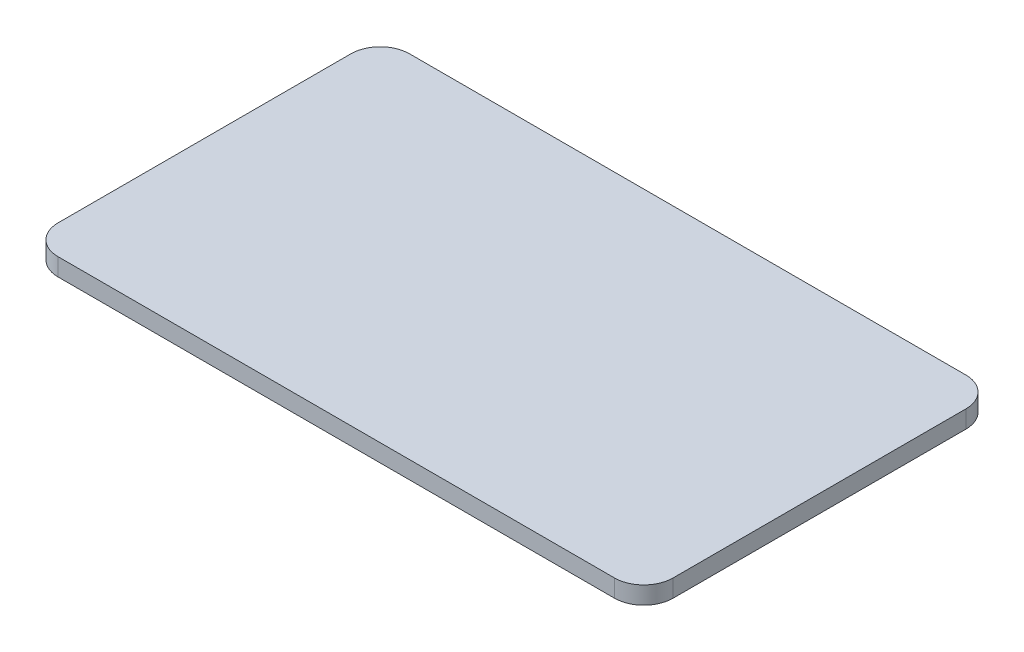
ISO-10303-21;
HEADER;
FILE_DESCRIPTION(('STEP AP214'),'2;1');
FILE_NAME('part.step','',(''),(''),'','','');
FILE_SCHEMA(('AUTOMOTIVE_DESIGN { 1 0 10303 214 1 1 1 1 }'));
ENDSEC;
DATA;
#1=APPLICATION_CONTEXT('core data for automotive mechanical design processes');
#2=APPLICATION_PROTOCOL_DEFINITION('international standard','automotive_design',2000,#1);
#3=PRODUCT_CONTEXT('',#1,'mechanical');
#4=PRODUCT('Part','Part','',(#3));
#5=PRODUCT_RELATED_PRODUCT_CATEGORY('part','',(#4));
#6=PRODUCT_DEFINITION_FORMATION('','',#4);
#7=PRODUCT_DEFINITION_CONTEXT('part definition',#1,'design');
#8=PRODUCT_DEFINITION('design','',#6,#7);
#9=PRODUCT_DEFINITION_SHAPE('','',#8);
#10=(LENGTH_UNIT() NAMED_UNIT(*) SI_UNIT(.MILLI.,.METRE.));
#11=(NAMED_UNIT(*) PLANE_ANGLE_UNIT() SI_UNIT($,.RADIAN.));
#12=(NAMED_UNIT(*) SI_UNIT($,.STERADIAN.) SOLID_ANGLE_UNIT());
#13=UNCERTAINTY_MEASURE_WITH_UNIT(LENGTH_MEASURE(1.E-05),#10,'distance_accuracy_value','');
#14=(GEOMETRIC_REPRESENTATION_CONTEXT(3) GLOBAL_UNCERTAINTY_ASSIGNED_CONTEXT((#13)) GLOBAL_UNIT_ASSIGNED_CONTEXT((#10,
#11,#12)) REPRESENTATION_CONTEXT('',''));
#15=CARTESIAN_POINT('',(0.,0.,0.));
#16=DIRECTION('',(0.,0.,1.));
#17=DIRECTION('',(1.,0.,0.));
#18=AXIS2_PLACEMENT_3D('',#15,#16,#17);
#19=CARTESIAN_POINT('',(47.5,3.,25.));
#20=DIRECTION('',(0.,-1.,0.));
#21=DIRECTION('',(0.,0.,-1.));
#22=AXIS2_PLACEMENT_3D('',#19,#20,#21);
#23=CYLINDRICAL_SURFACE('',#22,5.);
#24=CARTESIAN_POINT('',(47.5,0.,25.));
#25=DIRECTION('',(0.,1.,0.));
#26=DIRECTION('',(0.,0.,1.));
#27=AXIS2_PLACEMENT_3D('',#24,#25,#26);
#28=CIRCLE('',#27,5.);
#29=CARTESIAN_POINT('',(47.5,0.,30.));
#30=VERTEX_POINT('',#29);
#31=CARTESIAN_POINT('',(52.5,0.,25.));
#32=VERTEX_POINT('',#31);
#33=EDGE_CURVE('E129',#30,#32,#28,.T.);
#34=ORIENTED_EDGE('',*,*,#33,.T.);
#35=DIRECTION('',(0.,-1.,0.));
#36=VECTOR('',#35,1.);
#37=CARTESIAN_POINT('',(52.5,3.,25.));
#38=LINE('',#37,#36);
#39=CARTESIAN_POINT('',(52.5,3.,25.));
#40=VERTEX_POINT('',#39);
#41=EDGE_CURVE('E11',#40,#32,#38,.T.);
#42=ORIENTED_EDGE('',*,*,#41,.F.);
#43=CARTESIAN_POINT('',(47.5,3.,25.));
#44=DIRECTION('',(0.,1.,0.));
#45=DIRECTION('',(0.,0.,1.));
#46=AXIS2_PLACEMENT_3D('',#43,#44,#45);
#47=CIRCLE('',#46,5.);
#48=CARTESIAN_POINT('',(47.5,3.,30.));
#49=VERTEX_POINT('',#48);
#50=EDGE_CURVE('E143',#49,#40,#47,.T.);
#51=ORIENTED_EDGE('',*,*,#50,.F.);
#52=DIRECTION('',(0.,-1.,0.));
#53=VECTOR('',#52,1.);
#54=CARTESIAN_POINT('',(47.5,3.,30.));
#55=LINE('',#54,#53);
#56=EDGE_CURVE('E125',#49,#30,#55,.T.);
#57=ORIENTED_EDGE('',*,*,#56,.T.);
#58=EDGE_LOOP('',(#34,#42,#51,#57));
#59=FACE_BOUND('',#58,.T.);
#60=ADVANCED_FACE('F33',(#59),#23,.T.);
#61=CARTESIAN_POINT('',(52.5,3.,25.));
#62=DIRECTION('',(-1.,0.,0.));
#63=DIRECTION('',(0.,0.,1.));
#64=AXIS2_PLACEMENT_3D('',#61,#62,#63);
#65=PLANE('',#64);
#66=DIRECTION('',(0.,0.,-1.));
#67=VECTOR('',#66,1.);
#68=CARTESIAN_POINT('',(52.5,0.,25.));
#69=LINE('',#68,#67);
#70=CARTESIAN_POINT('',(52.5,0.,-25.));
#71=VERTEX_POINT('',#70);
#72=EDGE_CURVE('E132',#32,#71,#69,.T.);
#73=ORIENTED_EDGE('',*,*,#72,.T.);
#74=DIRECTION('',(0.,-1.,0.));
#75=VECTOR('',#74,1.);
#76=CARTESIAN_POINT('',(52.5,3.,-25.));
#77=LINE('',#76,#75);
#78=CARTESIAN_POINT('',(52.5,3.,-25.));
#79=VERTEX_POINT('',#78);
#80=EDGE_CURVE('E41',#79,#71,#77,.T.);
#81=ORIENTED_EDGE('',*,*,#80,.F.);
#82=DIRECTION('',(0.,0.,-1.));
#83=VECTOR('',#82,1.);
#84=CARTESIAN_POINT('',(52.5,3.,25.));
#85=LINE('',#84,#83);
#86=EDGE_CURVE('E92',#40,#79,#85,.T.);
#87=ORIENTED_EDGE('',*,*,#86,.F.);
#88=ORIENTED_EDGE('',*,*,#41,.T.);
#89=EDGE_LOOP('',(#73,#81,#87,#88));
#90=FACE_BOUND('',#89,.T.);
#91=ADVANCED_FACE('F178',(#90),#65,.F.);
#92=CARTESIAN_POINT('',(47.5,3.,-25.));
#93=DIRECTION('',(0.,-1.,0.));
#94=DIRECTION('',(0.,0.,-1.));
#95=AXIS2_PLACEMENT_3D('',#92,#93,#94);
#96=CYLINDRICAL_SURFACE('',#95,5.);
#97=CARTESIAN_POINT('',(47.5,0.,-25.));
#98=DIRECTION('',(0.,1.,0.));
#99=DIRECTION('',(0.,0.,1.));
#100=AXIS2_PLACEMENT_3D('',#97,#98,#99);
#101=CIRCLE('',#100,5.);
#102=CARTESIAN_POINT('',(47.5,0.,-30.));
#103=VERTEX_POINT('',#102);
#104=EDGE_CURVE('E134',#71,#103,#101,.T.);
#105=ORIENTED_EDGE('',*,*,#104,.T.);
#106=DIRECTION('',(0.,-1.,0.));
#107=VECTOR('',#106,1.);
#108=CARTESIAN_POINT('',(47.5,3.,-30.));
#109=LINE('',#108,#107);
#110=CARTESIAN_POINT('',(47.5,3.,-30.));
#111=VERTEX_POINT('',#110);
#112=EDGE_CURVE('E150',#111,#103,#109,.T.);
#113=ORIENTED_EDGE('',*,*,#112,.F.);
#114=CARTESIAN_POINT('',(47.5,3.,-25.));
#115=DIRECTION('',(0.,1.,0.));
#116=DIRECTION('',(0.,0.,1.));
#117=AXIS2_PLACEMENT_3D('',#114,#115,#116);
#118=CIRCLE('',#117,5.);
#119=EDGE_CURVE('E158',#79,#111,#118,.T.);
#120=ORIENTED_EDGE('',*,*,#119,.F.);
#121=ORIENTED_EDGE('',*,*,#80,.T.);
#122=EDGE_LOOP('',(#105,#113,#120,#121));
#123=FACE_BOUND('',#122,.T.);
#124=ADVANCED_FACE('F156',(#123),#96,.T.);
#125=CARTESIAN_POINT('',(47.5,3.,-30.));
#126=DIRECTION('',(0.,0.,1.));
#127=DIRECTION('',(1.,0.,0.));
#128=AXIS2_PLACEMENT_3D('',#125,#126,#127);
#129=PLANE('',#128);
#130=DIRECTION('',(-1.,0.,0.));
#131=VECTOR('',#130,1.);
#132=CARTESIAN_POINT('',(47.5,0.,-30.));
#133=LINE('',#132,#131);
#134=CARTESIAN_POINT('',(-47.5,0.,-30.));
#135=VERTEX_POINT('',#134);
#136=EDGE_CURVE('E136',#103,#135,#133,.T.);
#137=ORIENTED_EDGE('',*,*,#136,.T.);
#138=DIRECTION('',(0.,-1.,0.));
#139=VECTOR('',#138,1.);
#140=CARTESIAN_POINT('',(-47.5,3.,-30.));
#141=LINE('',#140,#139);
#142=CARTESIAN_POINT('',(-47.5,3.,-30.));
#143=VERTEX_POINT('',#142);
#144=EDGE_CURVE('E147',#143,#135,#141,.T.);
#145=ORIENTED_EDGE('',*,*,#144,.F.);
#146=DIRECTION('',(-1.,0.,0.));
#147=VECTOR('',#146,1.);
#148=CARTESIAN_POINT('',(47.5,3.,-30.));
#149=LINE('',#148,#147);
#150=EDGE_CURVE('E170',#111,#143,#149,.T.);
#151=ORIENTED_EDGE('',*,*,#150,.F.);
#152=ORIENTED_EDGE('',*,*,#112,.T.);
#153=EDGE_LOOP('',(#137,#145,#151,#152));
#154=FACE_BOUND('',#153,.T.);
#155=ADVANCED_FACE('F166',(#154),#129,.F.);
#156=CARTESIAN_POINT('',(-47.5,3.,-25.));
#157=DIRECTION('',(0.,-1.,0.));
#158=DIRECTION('',(0.,0.,-1.));
#159=AXIS2_PLACEMENT_3D('',#156,#157,#158);
#160=CYLINDRICAL_SURFACE('',#159,5.);
#161=CARTESIAN_POINT('',(-47.5,0.,-25.));
#162=DIRECTION('',(0.,1.,0.));
#163=DIRECTION('',(0.,0.,1.));
#164=AXIS2_PLACEMENT_3D('',#161,#162,#163);
#165=CIRCLE('',#164,5.);
#166=CARTESIAN_POINT('',(-52.5,0.,-25.));
#167=VERTEX_POINT('',#166);
#168=EDGE_CURVE('E138',#135,#167,#165,.T.);
#169=ORIENTED_EDGE('',*,*,#168,.T.);
#170=DIRECTION('',(0.,-1.,0.));
#171=VECTOR('',#170,1.);
#172=CARTESIAN_POINT('',(-52.5,3.,-25.));
#173=LINE('',#172,#171);
#174=CARTESIAN_POINT('',(-52.5,3.,-25.));
#175=VERTEX_POINT('',#174);
#176=EDGE_CURVE('E120',#175,#167,#173,.T.);
#177=ORIENTED_EDGE('',*,*,#176,.F.);
#178=CARTESIAN_POINT('',(-47.5,3.,-25.));
#179=DIRECTION('',(0.,1.,0.));
#180=DIRECTION('',(0.,0.,1.));
#181=AXIS2_PLACEMENT_3D('',#178,#179,#180);
#182=CIRCLE('',#181,5.);
#183=EDGE_CURVE('E111',#143,#175,#182,.T.);
#184=ORIENTED_EDGE('',*,*,#183,.F.);
#185=ORIENTED_EDGE('',*,*,#144,.T.);
#186=EDGE_LOOP('',(#169,#177,#184,#185));
#187=FACE_BOUND('',#186,.T.);
#188=ADVANCED_FACE('F169',(#187),#160,.T.);
#189=CARTESIAN_POINT('',(-52.5,3.,25.));
#190=DIRECTION('',(1.,0.,0.));
#191=DIRECTION('',(0.,0.,-1.));
#192=AXIS2_PLACEMENT_3D('',#189,#190,#191);
#193=PLANE('',#192);
#194=DIRECTION('',(0.,0.,1.));
#195=VECTOR('',#194,1.);
#196=CARTESIAN_POINT('',(-52.5,0.,25.));
#197=LINE('',#196,#195);
#198=CARTESIAN_POINT('',(-52.5,0.,25.));
#199=VERTEX_POINT('',#198);
#200=EDGE_CURVE('E119',#167,#199,#197,.T.);
#201=ORIENTED_EDGE('',*,*,#200,.T.);
#202=DIRECTION('',(0.,-1.,0.));
#203=VECTOR('',#202,1.);
#204=CARTESIAN_POINT('',(-52.5,3.,25.));
#205=LINE('',#204,#203);
#206=CARTESIAN_POINT('',(-52.5,3.,25.));
#207=VERTEX_POINT('',#206);
#208=EDGE_CURVE('E116',#207,#199,#205,.T.);
#209=ORIENTED_EDGE('',*,*,#208,.F.);
#210=DIRECTION('',(0.,0.,1.));
#211=VECTOR('',#210,1.);
#212=CARTESIAN_POINT('',(-52.5,3.,25.));
#213=LINE('',#212,#211);
#214=EDGE_CURVE('E105',#175,#207,#213,.T.);
#215=ORIENTED_EDGE('',*,*,#214,.F.);
#216=ORIENTED_EDGE('',*,*,#176,.T.);
#217=EDGE_LOOP('',(#201,#209,#215,#216));
#218=FACE_BOUND('',#217,.T.);
#219=ADVANCED_FACE('F117',(#218),#193,.F.);
#220=CARTESIAN_POINT('',(-47.5,3.,25.));
#221=DIRECTION('',(0.,-1.,0.));
#222=DIRECTION('',(0.,0.,-1.));
#223=AXIS2_PLACEMENT_3D('',#220,#221,#222);
#224=CYLINDRICAL_SURFACE('',#223,5.);
#225=CARTESIAN_POINT('',(-47.5,0.,25.));
#226=DIRECTION('',(0.,1.,0.));
#227=DIRECTION('',(0.,0.,-1.));
#228=AXIS2_PLACEMENT_3D('',#225,#226,#227);
#229=CIRCLE('',#228,5.);
#230=CARTESIAN_POINT('',(-47.5,0.,30.));
#231=VERTEX_POINT('',#230);
#232=EDGE_CURVE('E78',#199,#231,#229,.T.);
#233=ORIENTED_EDGE('',*,*,#232,.T.);
#234=DIRECTION('',(0.,-1.,0.));
#235=VECTOR('',#234,1.);
#236=CARTESIAN_POINT('',(-47.5,3.,30.));
#237=LINE('',#236,#235);
#238=CARTESIAN_POINT('',(-47.5,3.,30.));
#239=VERTEX_POINT('',#238);
#240=EDGE_CURVE('E121',#239,#231,#237,.T.);
#241=ORIENTED_EDGE('',*,*,#240,.F.);
#242=CARTESIAN_POINT('',(-47.5,3.,25.));
#243=DIRECTION('',(0.,1.,0.));
#244=DIRECTION('',(0.,0.,-1.));
#245=AXIS2_PLACEMENT_3D('',#242,#243,#244);
#246=CIRCLE('',#245,5.);
#247=EDGE_CURVE('E109',#207,#239,#246,.T.);
#248=ORIENTED_EDGE('',*,*,#247,.F.);
#249=ORIENTED_EDGE('',*,*,#208,.T.);
#250=EDGE_LOOP('',(#233,#241,#248,#249));
#251=FACE_BOUND('',#250,.T.);
#252=ADVANCED_FACE('F123',(#251),#224,.T.);
#253=CARTESIAN_POINT('',(47.5,3.,30.));
#254=DIRECTION('',(0.,0.,-1.));
#255=DIRECTION('',(-1.,0.,0.));
#256=AXIS2_PLACEMENT_3D('',#253,#254,#255);
#257=PLANE('',#256);
#258=DIRECTION('',(1.,0.,0.));
#259=VECTOR('',#258,1.);
#260=CARTESIAN_POINT('',(47.5,0.,30.));
#261=LINE('',#260,#259);
#262=EDGE_CURVE('E84',#231,#30,#261,.T.);
#263=ORIENTED_EDGE('',*,*,#262,.T.);
#264=ORIENTED_EDGE('',*,*,#56,.F.);
#265=DIRECTION('',(1.,0.,0.));
#266=VECTOR('',#265,1.);
#267=CARTESIAN_POINT('',(47.5,3.,30.));
#268=LINE('',#267,#266);
#269=EDGE_CURVE('E49',#239,#49,#268,.T.);
#270=ORIENTED_EDGE('',*,*,#269,.F.);
#271=ORIENTED_EDGE('',*,*,#240,.T.);
#272=EDGE_LOOP('',(#263,#264,#270,#271));
#273=FACE_BOUND('',#272,.T.);
#274=ADVANCED_FACE('F194',(#273),#257,.F.);
#275=CARTESIAN_POINT('',(47.5,3.,25.));
#276=DIRECTION('',(0.,1.,0.));
#277=DIRECTION('',(0.,0.,1.));
#278=AXIS2_PLACEMENT_3D('',#275,#276,#277);
#279=PLANE('',#278);
#280=ORIENTED_EDGE('',*,*,#50,.T.);
#281=ORIENTED_EDGE('',*,*,#86,.T.);
#282=ORIENTED_EDGE('',*,*,#119,.T.);
#283=ORIENTED_EDGE('',*,*,#150,.T.);
#284=ORIENTED_EDGE('',*,*,#183,.T.);
#285=ORIENTED_EDGE('',*,*,#214,.T.);
#286=ORIENTED_EDGE('',*,*,#247,.T.);
#287=ORIENTED_EDGE('',*,*,#269,.T.);
#288=EDGE_LOOP('',(#280,#281,#282,#283,#284,#285,#286,#287));
#289=FACE_BOUND('',#288,.T.);
#290=ADVANCED_FACE('F107',(#289),#279,.T.);
#291=CARTESIAN_POINT('',(47.5,0.,25.));
#292=DIRECTION('',(0.,1.,0.));
#293=DIRECTION('',(0.,0.,1.));
#294=AXIS2_PLACEMENT_3D('',#291,#292,#293);
#295=PLANE('',#294);
#296=ORIENTED_EDGE('',*,*,#33,.F.);
#297=ORIENTED_EDGE('',*,*,#262,.F.);
#298=ORIENTED_EDGE('',*,*,#232,.F.);
#299=ORIENTED_EDGE('',*,*,#200,.F.);
#300=ORIENTED_EDGE('',*,*,#168,.F.);
#301=ORIENTED_EDGE('',*,*,#136,.F.);
#302=ORIENTED_EDGE('',*,*,#104,.F.);
#303=ORIENTED_EDGE('',*,*,#72,.F.);
#304=EDGE_LOOP('',(#296,#297,#298,#299,#300,#301,#302,#303));
#305=FACE_BOUND('',#304,.T.);
#306=ADVANCED_FACE('F162',(#305),#295,.F.);
#307=CLOSED_SHELL('',(#60,#91,#124,#155,#188,#219,#252,#274,#290,#306));
#308=MANIFOLD_SOLID_BREP('B2',#307);
#309=ADVANCED_BREP_SHAPE_REPRESENTATION('',(#18,#308),#14);
#310=SHAPE_DEFINITION_REPRESENTATION(#9,#309);
ENDSEC;
END-ISO-10303-21;
